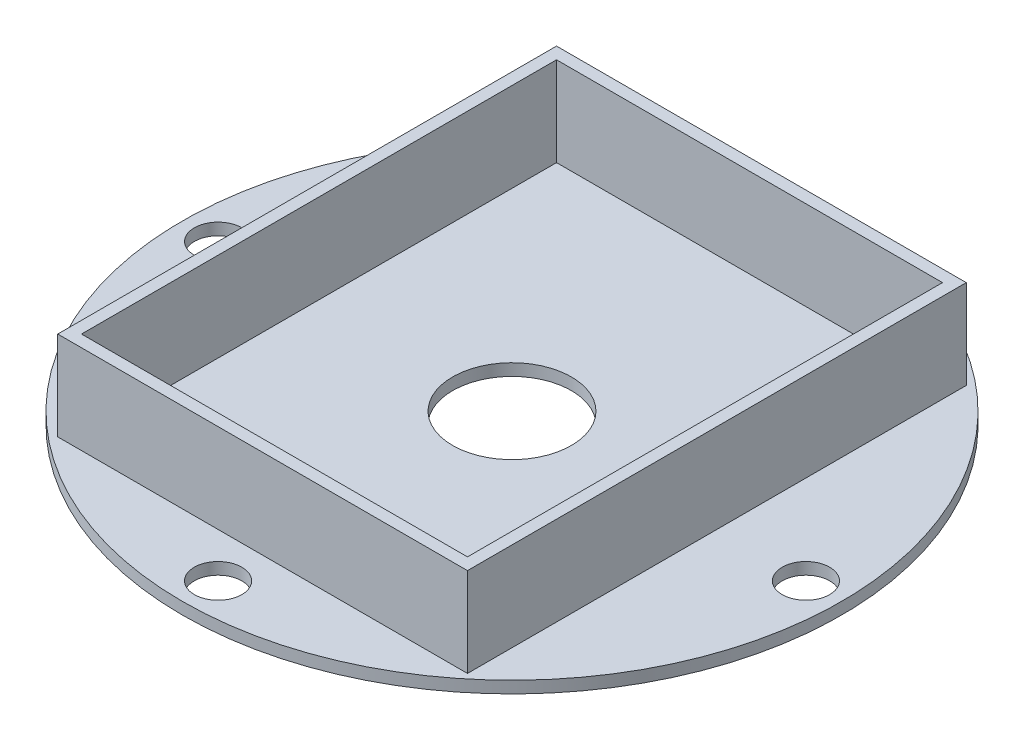
ISO-10303-21;
HEADER;
FILE_DESCRIPTION(('STEP AP214'),'2;1');
FILE_NAME('part.step','',(''),(''),'','','');
FILE_SCHEMA(('AUTOMOTIVE_DESIGN { 1 0 10303 214 1 1 1 1 }'));
ENDSEC;
DATA;
#1=APPLICATION_CONTEXT('core data for automotive mechanical design processes');
#2=APPLICATION_PROTOCOL_DEFINITION('international standard','automotive_design',2000,#1);
#3=PRODUCT_CONTEXT('',#1,'mechanical');
#4=PRODUCT('Part','Part','',(#3));
#5=PRODUCT_RELATED_PRODUCT_CATEGORY('part','',(#4));
#6=PRODUCT_DEFINITION_FORMATION('','',#4);
#7=PRODUCT_DEFINITION_CONTEXT('part definition',#1,'design');
#8=PRODUCT_DEFINITION('design','',#6,#7);
#9=PRODUCT_DEFINITION_SHAPE('','',#8);
#10=(LENGTH_UNIT() NAMED_UNIT(*) SI_UNIT(.MILLI.,.METRE.));
#11=(NAMED_UNIT(*) PLANE_ANGLE_UNIT() SI_UNIT($,.RADIAN.));
#12=(NAMED_UNIT(*) SI_UNIT($,.STERADIAN.) SOLID_ANGLE_UNIT());
#13=UNCERTAINTY_MEASURE_WITH_UNIT(LENGTH_MEASURE(1.E-05),#10,'distance_accuracy_value','');
#14=(GEOMETRIC_REPRESENTATION_CONTEXT(3) GLOBAL_UNCERTAINTY_ASSIGNED_CONTEXT((#13)) GLOBAL_UNIT_ASSIGNED_CONTEXT((#10,
#11,#12)) REPRESENTATION_CONTEXT('',''));
#15=CARTESIAN_POINT('',(0.,0.,0.));
#16=DIRECTION('',(0.,0.,1.));
#17=DIRECTION('',(1.,0.,0.));
#18=AXIS2_PLACEMENT_3D('',#15,#16,#17);
#19=CARTESIAN_POINT('',(0.,2.,0.));
#20=DIRECTION('',(0.,1.,0.));
#21=DIRECTION('',(0.,0.,1.));
#22=AXIS2_PLACEMENT_3D('',#19,#20,#21);
#23=PLANE('',#22);
#24=CARTESIAN_POINT('',(0.,2.,49.5));
#25=DIRECTION('',(0.,1.,0.));
#26=DIRECTION('',(0.,0.,1.));
#27=AXIS2_PLACEMENT_3D('',#24,#25,#26);
#28=CIRCLE('',#27,4.);
#29=CARTESIAN_POINT('',(0.,2.,53.5));
#30=VERTEX_POINT('',#29);
#31=EDGE_CURVE('E206',#30,#30,#28,.T.);
#32=ORIENTED_EDGE('',*,*,#31,.F.);
#33=EDGE_LOOP('',(#32));
#34=FACE_BOUND('',#33,.T.);
#35=CARTESIAN_POINT('',(49.5,2.,0.));
#36=DIRECTION('',(0.,1.,0.));
#37=DIRECTION('',(0.,0.,1.));
#38=AXIS2_PLACEMENT_3D('',#35,#36,#37);
#39=CIRCLE('',#38,4.);
#40=CARTESIAN_POINT('',(49.5,2.,4.));
#41=VERTEX_POINT('',#40);
#42=EDGE_CURVE('E222',#41,#41,#39,.T.);
#43=ORIENTED_EDGE('',*,*,#42,.F.);
#44=EDGE_LOOP('',(#43));
#45=FACE_BOUND('',#44,.T.);
#46=CARTESIAN_POINT('',(0.,2.,0.));
#47=DIRECTION('',(0.,1.,0.));
#48=DIRECTION('',(0.,0.,1.));
#49=AXIS2_PLACEMENT_3D('',#46,#47,#48);
#50=CIRCLE('',#49,55.5);
#51=CARTESIAN_POINT('',(0.,2.,55.5));
#52=VERTEX_POINT('',#51);
#53=EDGE_CURVE('E11',#52,#52,#50,.T.);
#54=ORIENTED_EDGE('',*,*,#53,.T.);
#55=EDGE_LOOP('',(#54));
#56=FACE_BOUND('',#55,.T.);
#57=CARTESIAN_POINT('',(0.,2.,-49.5));
#58=DIRECTION('',(0.,1.,0.));
#59=DIRECTION('',(0.,0.,1.));
#60=AXIS2_PLACEMENT_3D('',#57,#58,#59);
#61=CIRCLE('',#60,4.);
#62=CARTESIAN_POINT('',(0.,2.,-45.5));
#63=VERTEX_POINT('',#62);
#64=EDGE_CURVE('E230',#63,#63,#61,.T.);
#65=ORIENTED_EDGE('',*,*,#64,.F.);
#66=EDGE_LOOP('',(#65));
#67=FACE_BOUND('',#66,.T.);
#68=CARTESIAN_POINT('',(-49.5,2.,0.));
#69=DIRECTION('',(0.,1.,0.));
#70=DIRECTION('',(0.,0.,1.));
#71=AXIS2_PLACEMENT_3D('',#68,#69,#70);
#72=CIRCLE('',#71,4.);
#73=CARTESIAN_POINT('',(-49.5,2.,4.));
#74=VERTEX_POINT('',#73);
#75=EDGE_CURVE('E214',#74,#74,#72,.T.);
#76=ORIENTED_EDGE('',*,*,#75,.F.);
#77=EDGE_LOOP('',(#76));
#78=FACE_BOUND('',#77,.T.);
#79=DIRECTION('',(-1.,0.,0.));
#80=VECTOR('',#79,1.);
#81=CARTESIAN_POINT('',(-34.5,2.,-42.));
#82=LINE('',#81,#80);
#83=CARTESIAN_POINT('',(34.5,2.,-42.));
#84=VERTEX_POINT('',#83);
#85=CARTESIAN_POINT('',(-34.5,2.,-42.));
#86=VERTEX_POINT('',#85);
#87=EDGE_CURVE('E185',#84,#86,#82,.T.);
#88=ORIENTED_EDGE('',*,*,#87,.F.);
#89=DIRECTION('',(0.,0.,-1.));
#90=VECTOR('',#89,1.);
#91=CARTESIAN_POINT('',(34.5,2.,-42.));
#92=LINE('',#91,#90);
#93=CARTESIAN_POINT('',(34.5,2.,42.));
#94=VERTEX_POINT('',#93);
#95=EDGE_CURVE('E134',#94,#84,#92,.T.);
#96=ORIENTED_EDGE('',*,*,#95,.F.);
#97=DIRECTION('',(1.,0.,0.));
#98=VECTOR('',#97,1.);
#99=CARTESIAN_POINT('',(-34.5,2.,42.));
#100=LINE('',#99,#98);
#101=CARTESIAN_POINT('',(-34.5,2.,42.));
#102=VERTEX_POINT('',#101);
#103=EDGE_CURVE('E172',#102,#94,#100,.T.);
#104=ORIENTED_EDGE('',*,*,#103,.F.);
#105=DIRECTION('',(0.,0.,1.));
#106=VECTOR('',#105,1.);
#107=CARTESIAN_POINT('',(-34.5,2.,-42.));
#108=LINE('',#107,#106);
#109=EDGE_CURVE('E188',#86,#102,#108,.T.);
#110=ORIENTED_EDGE('',*,*,#109,.F.);
#111=EDGE_LOOP('',(#88,#96,#104,#110));
#112=FACE_BOUND('',#111,.T.);
#113=ADVANCED_FACE('F45',(#34,#45,#56,#67,#78,#112),#23,.T.);
#114=CARTESIAN_POINT('',(0.,0.,0.));
#115=DIRECTION('',(0.,1.,0.));
#116=DIRECTION('',(0.,0.,1.));
#117=AXIS2_PLACEMENT_3D('',#114,#115,#116);
#118=PLANE('',#117);
#119=CARTESIAN_POINT('',(0.,0.,0.));
#120=DIRECTION('',(0.,1.,0.));
#121=DIRECTION('',(0.,0.,1.));
#122=AXIS2_PLACEMENT_3D('',#119,#120,#121);
#123=CIRCLE('',#122,10.);
#124=CARTESIAN_POINT('',(0.,0.,10.));
#125=VERTEX_POINT('',#124);
#126=EDGE_CURVE('E49',#125,#125,#123,.T.);
#127=ORIENTED_EDGE('',*,*,#126,.T.);
#128=EDGE_LOOP('',(#127));
#129=FACE_BOUND('',#128,.T.);
#130=CARTESIAN_POINT('',(0.,0.,0.));
#131=DIRECTION('',(0.,1.,0.));
#132=DIRECTION('',(0.,0.,1.));
#133=AXIS2_PLACEMENT_3D('',#130,#131,#132);
#134=CIRCLE('',#133,55.5);
#135=CARTESIAN_POINT('',(0.,0.,55.5));
#136=VERTEX_POINT('',#135);
#137=EDGE_CURVE('E55',#136,#136,#134,.T.);
#138=ORIENTED_EDGE('',*,*,#137,.F.);
#139=EDGE_LOOP('',(#138));
#140=FACE_BOUND('',#139,.T.);
#141=CARTESIAN_POINT('',(0.,0.,-49.5));
#142=DIRECTION('',(0.,1.,0.));
#143=DIRECTION('',(0.,0.,1.));
#144=AXIS2_PLACEMENT_3D('',#141,#142,#143);
#145=CIRCLE('',#144,4.);
#146=CARTESIAN_POINT('',(0.,0.,-45.5));
#147=VERTEX_POINT('',#146);
#148=EDGE_CURVE('E226',#147,#147,#145,.T.);
#149=ORIENTED_EDGE('',*,*,#148,.T.);
#150=EDGE_LOOP('',(#149));
#151=FACE_BOUND('',#150,.T.);
#152=CARTESIAN_POINT('',(49.5,0.,0.));
#153=DIRECTION('',(0.,1.,0.));
#154=DIRECTION('',(0.,0.,1.));
#155=AXIS2_PLACEMENT_3D('',#152,#153,#154);
#156=CIRCLE('',#155,4.);
#157=CARTESIAN_POINT('',(49.5,0.,4.));
#158=VERTEX_POINT('',#157);
#159=EDGE_CURVE('E218',#158,#158,#156,.T.);
#160=ORIENTED_EDGE('',*,*,#159,.T.);
#161=EDGE_LOOP('',(#160));
#162=FACE_BOUND('',#161,.T.);
#163=CARTESIAN_POINT('',(-49.5,0.,0.));
#164=DIRECTION('',(0.,1.,0.));
#165=DIRECTION('',(0.,0.,1.));
#166=AXIS2_PLACEMENT_3D('',#163,#164,#165);
#167=CIRCLE('',#166,4.);
#168=CARTESIAN_POINT('',(-49.5,0.,4.));
#169=VERTEX_POINT('',#168);
#170=EDGE_CURVE('E210',#169,#169,#167,.T.);
#171=ORIENTED_EDGE('',*,*,#170,.T.);
#172=EDGE_LOOP('',(#171));
#173=FACE_BOUND('',#172,.T.);
#174=CARTESIAN_POINT('',(0.,0.,49.5));
#175=DIRECTION('',(0.,1.,0.));
#176=DIRECTION('',(0.,0.,1.));
#177=AXIS2_PLACEMENT_3D('',#174,#175,#176);
#178=CIRCLE('',#177,4.);
#179=CARTESIAN_POINT('',(0.,0.,53.5));
#180=VERTEX_POINT('',#179);
#181=EDGE_CURVE('E205',#180,#180,#178,.T.);
#182=ORIENTED_EDGE('',*,*,#181,.T.);
#183=EDGE_LOOP('',(#182));
#184=FACE_BOUND('',#183,.T.);
#185=ADVANCED_FACE('F241',(#129,#140,#151,#162,#173,#184),#118,.F.);
#186=CARTESIAN_POINT('',(0.,2.,0.));
#187=DIRECTION('',(0.,-1.,0.));
#188=DIRECTION('',(0.,0.,-1.));
#189=AXIS2_PLACEMENT_3D('',#186,#187,#188);
#190=CYLINDRICAL_SURFACE('',#189,55.5);
#191=ORIENTED_EDGE('',*,*,#53,.F.);
#192=EDGE_LOOP('',(#191));
#193=FACE_BOUND('',#192,.T.);
#194=ORIENTED_EDGE('',*,*,#137,.T.);
#195=EDGE_LOOP('',(#194));
#196=FACE_BOUND('',#195,.T.);
#197=ADVANCED_FACE('F47',(#193,#196),#190,.T.);
#198=CARTESIAN_POINT('',(0.,2.,-49.5));
#199=DIRECTION('',(0.,-1.,0.));
#200=DIRECTION('',(0.,0.,-1.));
#201=AXIS2_PLACEMENT_3D('',#198,#199,#200);
#202=CYLINDRICAL_SURFACE('',#201,4.);
#203=ORIENTED_EDGE('',*,*,#64,.T.);
#204=EDGE_LOOP('',(#203));
#205=FACE_BOUND('',#204,.T.);
#206=ORIENTED_EDGE('',*,*,#148,.F.);
#207=EDGE_LOOP('',(#206));
#208=FACE_BOUND('',#207,.T.);
#209=ADVANCED_FACE('F408',(#205,#208),#202,.F.);
#210=CARTESIAN_POINT('',(49.5,2.,0.));
#211=DIRECTION('',(0.,-1.,0.));
#212=DIRECTION('',(0.,0.,-1.));
#213=AXIS2_PLACEMENT_3D('',#210,#211,#212);
#214=CYLINDRICAL_SURFACE('',#213,4.);
#215=ORIENTED_EDGE('',*,*,#42,.T.);
#216=EDGE_LOOP('',(#215));
#217=FACE_BOUND('',#216,.T.);
#218=ORIENTED_EDGE('',*,*,#159,.F.);
#219=EDGE_LOOP('',(#218));
#220=FACE_BOUND('',#219,.T.);
#221=ADVANCED_FACE('F266',(#217,#220),#214,.F.);
#222=CARTESIAN_POINT('',(-49.5,2.,0.));
#223=DIRECTION('',(0.,-1.,0.));
#224=DIRECTION('',(0.,0.,-1.));
#225=AXIS2_PLACEMENT_3D('',#222,#223,#224);
#226=CYLINDRICAL_SURFACE('',#225,4.);
#227=ORIENTED_EDGE('',*,*,#75,.T.);
#228=EDGE_LOOP('',(#227));
#229=FACE_BOUND('',#228,.T.);
#230=ORIENTED_EDGE('',*,*,#170,.F.);
#231=EDGE_LOOP('',(#230));
#232=FACE_BOUND('',#231,.T.);
#233=ADVANCED_FACE('F255',(#229,#232),#226,.F.);
#234=CARTESIAN_POINT('',(0.,2.,49.5));
#235=DIRECTION('',(0.,-1.,0.));
#236=DIRECTION('',(0.,0.,-1.));
#237=AXIS2_PLACEMENT_3D('',#234,#235,#236);
#238=CYLINDRICAL_SURFACE('',#237,4.);
#239=ORIENTED_EDGE('',*,*,#31,.T.);
#240=EDGE_LOOP('',(#239));
#241=FACE_BOUND('',#240,.T.);
#242=ORIENTED_EDGE('',*,*,#181,.F.);
#243=EDGE_LOOP('',(#242));
#244=FACE_BOUND('',#243,.T.);
#245=ADVANCED_FACE('F253',(#241,#244),#238,.F.);
#246=CARTESIAN_POINT('',(0.,17.,0.));
#247=DIRECTION('',(0.,1.,0.));
#248=DIRECTION('',(0.,0.,1.));
#249=AXIS2_PLACEMENT_3D('',#246,#247,#248);
#250=PLANE('',#249);
#251=DIRECTION('',(0.,0.,-1.));
#252=VECTOR('',#251,1.);
#253=CARTESIAN_POINT('',(34.5,17.,-42.));
#254=LINE('',#253,#252);
#255=CARTESIAN_POINT('',(34.5,17.,42.));
#256=VERTEX_POINT('',#255);
#257=CARTESIAN_POINT('',(34.5,17.,-42.));
#258=VERTEX_POINT('',#257);
#259=EDGE_CURVE('E167',#256,#258,#254,.T.);
#260=ORIENTED_EDGE('',*,*,#259,.T.);
#261=DIRECTION('',(-1.,0.,0.));
#262=VECTOR('',#261,1.);
#263=CARTESIAN_POINT('',(-34.5,17.,-42.));
#264=LINE('',#263,#262);
#265=CARTESIAN_POINT('',(-34.5,17.,-42.));
#266=VERTEX_POINT('',#265);
#267=EDGE_CURVE('E171',#258,#266,#264,.T.);
#268=ORIENTED_EDGE('',*,*,#267,.T.);
#269=DIRECTION('',(0.,0.,1.));
#270=VECTOR('',#269,1.);
#271=CARTESIAN_POINT('',(-34.5,17.,-42.));
#272=LINE('',#271,#270);
#273=CARTESIAN_POINT('',(-34.5,17.,42.));
#274=VERTEX_POINT('',#273);
#275=EDGE_CURVE('E175',#266,#274,#272,.T.);
#276=ORIENTED_EDGE('',*,*,#275,.T.);
#277=DIRECTION('',(1.,0.,0.));
#278=VECTOR('',#277,1.);
#279=CARTESIAN_POINT('',(-34.5,17.,42.));
#280=LINE('',#279,#278);
#281=EDGE_CURVE('E178',#274,#256,#280,.T.);
#282=ORIENTED_EDGE('',*,*,#281,.T.);
#283=EDGE_LOOP('',(#260,#268,#276,#282));
#284=FACE_BOUND('',#283,.T.);
#285=DIRECTION('',(-1.,0.,0.));
#286=VECTOR('',#285,1.);
#287=CARTESIAN_POINT('',(-32.5,17.,-40.));
#288=LINE('',#287,#286);
#289=CARTESIAN_POINT('',(32.5,17.,-40.));
#290=VERTEX_POINT('',#289);
#291=CARTESIAN_POINT('',(-32.5,17.,-40.));
#292=VERTEX_POINT('',#291);
#293=EDGE_CURVE('E125',#290,#292,#288,.T.);
#294=ORIENTED_EDGE('',*,*,#293,.F.);
#295=DIRECTION('',(0.,0.,-1.));
#296=VECTOR('',#295,1.);
#297=CARTESIAN_POINT('',(32.5,17.,-40.));
#298=LINE('',#297,#296);
#299=CARTESIAN_POINT('',(32.5,17.,40.));
#300=VERTEX_POINT('',#299);
#301=EDGE_CURVE('E115',#300,#290,#298,.T.);
#302=ORIENTED_EDGE('',*,*,#301,.F.);
#303=DIRECTION('',(1.,0.,0.));
#304=VECTOR('',#303,1.);
#305=CARTESIAN_POINT('',(-32.5,17.,40.));
#306=LINE('',#305,#304);
#307=CARTESIAN_POINT('',(-32.5,17.,40.));
#308=VERTEX_POINT('',#307);
#309=EDGE_CURVE('E144',#308,#300,#306,.T.);
#310=ORIENTED_EDGE('',*,*,#309,.F.);
#311=DIRECTION('',(0.,0.,1.));
#312=VECTOR('',#311,1.);
#313=CARTESIAN_POINT('',(-32.5,17.,-40.));
#314=LINE('',#313,#312);
#315=EDGE_CURVE('E140',#292,#308,#314,.T.);
#316=ORIENTED_EDGE('',*,*,#315,.F.);
#317=EDGE_LOOP('',(#294,#302,#310,#316));
#318=FACE_BOUND('',#317,.T.);
#319=ADVANCED_FACE('F138',(#284,#318),#250,.T.);
#320=CARTESIAN_POINT('',(34.5,17.,-42.));
#321=DIRECTION('',(-1.,0.,0.));
#322=DIRECTION('',(0.,0.,1.));
#323=AXIS2_PLACEMENT_3D('',#320,#321,#322);
#324=PLANE('',#323);
#325=ORIENTED_EDGE('',*,*,#95,.T.);
#326=DIRECTION('',(0.,-1.,0.));
#327=VECTOR('',#326,1.);
#328=CARTESIAN_POINT('',(34.5,17.,-42.));
#329=LINE('',#328,#327);
#330=EDGE_CURVE('E202',#258,#84,#329,.T.);
#331=ORIENTED_EDGE('',*,*,#330,.F.);
#332=ORIENTED_EDGE('',*,*,#259,.F.);
#333=DIRECTION('',(0.,-1.,0.));
#334=VECTOR('',#333,1.);
#335=CARTESIAN_POINT('',(34.5,17.,42.));
#336=LINE('',#335,#334);
#337=EDGE_CURVE('E181',#256,#94,#336,.T.);
#338=ORIENTED_EDGE('',*,*,#337,.T.);
#339=EDGE_LOOP('',(#325,#331,#332,#338));
#340=FACE_BOUND('',#339,.T.);
#341=ADVANCED_FACE('F263',(#340),#324,.F.);
#342=CARTESIAN_POINT('',(-34.5,17.,-42.));
#343=DIRECTION('',(0.,0.,1.));
#344=DIRECTION('',(1.,0.,0.));
#345=AXIS2_PLACEMENT_3D('',#342,#343,#344);
#346=PLANE('',#345);
#347=ORIENTED_EDGE('',*,*,#87,.T.);
#348=DIRECTION('',(0.,-1.,0.));
#349=VECTOR('',#348,1.);
#350=CARTESIAN_POINT('',(-34.5,17.,-42.));
#351=LINE('',#350,#349);
#352=EDGE_CURVE('E198',#266,#86,#351,.T.);
#353=ORIENTED_EDGE('',*,*,#352,.F.);
#354=ORIENTED_EDGE('',*,*,#267,.F.);
#355=ORIENTED_EDGE('',*,*,#330,.T.);
#356=EDGE_LOOP('',(#347,#353,#354,#355));
#357=FACE_BOUND('',#356,.T.);
#358=ADVANCED_FACE('F316',(#357),#346,.F.);
#359=CARTESIAN_POINT('',(-34.5,17.,-42.));
#360=DIRECTION('',(1.,0.,0.));
#361=DIRECTION('',(0.,0.,-1.));
#362=AXIS2_PLACEMENT_3D('',#359,#360,#361);
#363=PLANE('',#362);
#364=ORIENTED_EDGE('',*,*,#109,.T.);
#365=DIRECTION('',(0.,-1.,0.));
#366=VECTOR('',#365,1.);
#367=CARTESIAN_POINT('',(-34.5,17.,42.));
#368=LINE('',#367,#366);
#369=EDGE_CURVE('E63',#274,#102,#368,.T.);
#370=ORIENTED_EDGE('',*,*,#369,.F.);
#371=ORIENTED_EDGE('',*,*,#275,.F.);
#372=ORIENTED_EDGE('',*,*,#352,.T.);
#373=EDGE_LOOP('',(#364,#370,#371,#372));
#374=FACE_BOUND('',#373,.T.);
#375=ADVANCED_FACE('F313',(#374),#363,.F.);
#376=CARTESIAN_POINT('',(-34.5,17.,42.));
#377=DIRECTION('',(0.,0.,-1.));
#378=DIRECTION('',(-1.,0.,0.));
#379=AXIS2_PLACEMENT_3D('',#376,#377,#378);
#380=PLANE('',#379);
#381=ORIENTED_EDGE('',*,*,#103,.T.);
#382=ORIENTED_EDGE('',*,*,#337,.F.);
#383=ORIENTED_EDGE('',*,*,#281,.F.);
#384=ORIENTED_EDGE('',*,*,#369,.T.);
#385=EDGE_LOOP('',(#381,#382,#383,#384));
#386=FACE_BOUND('',#385,.T.);
#387=ADVANCED_FACE('F309',(#386),#380,.F.);
#388=CARTESIAN_POINT('',(32.5,17.,-40.));
#389=DIRECTION('',(-1.,0.,0.));
#390=DIRECTION('',(0.,0.,1.));
#391=AXIS2_PLACEMENT_3D('',#388,#389,#390);
#392=PLANE('',#391);
#393=DIRECTION('',(0.,0.,-1.));
#394=VECTOR('',#393,1.);
#395=CARTESIAN_POINT('',(32.5,2.,-40.));
#396=LINE('',#395,#394);
#397=CARTESIAN_POINT('',(32.5,2.,40.));
#398=VERTEX_POINT('',#397);
#399=CARTESIAN_POINT('',(32.5,2.,-40.));
#400=VERTEX_POINT('',#399);
#401=EDGE_CURVE('E71',#398,#400,#396,.T.);
#402=ORIENTED_EDGE('',*,*,#401,.F.);
#403=DIRECTION('',(0.,-1.,0.));
#404=VECTOR('',#403,1.);
#405=CARTESIAN_POINT('',(32.5,17.,40.));
#406=LINE('',#405,#404);
#407=EDGE_CURVE('E120',#300,#398,#406,.T.);
#408=ORIENTED_EDGE('',*,*,#407,.F.);
#409=ORIENTED_EDGE('',*,*,#301,.T.);
#410=DIRECTION('',(0.,-1.,0.));
#411=VECTOR('',#410,1.);
#412=CARTESIAN_POINT('',(32.5,17.,-40.));
#413=LINE('',#412,#411);
#414=EDGE_CURVE('E118',#290,#400,#413,.T.);
#415=ORIENTED_EDGE('',*,*,#414,.T.);
#416=EDGE_LOOP('',(#402,#408,#409,#415));
#417=FACE_BOUND('',#416,.T.);
#418=ADVANCED_FACE('F117',(#417),#392,.T.);
#419=CARTESIAN_POINT('',(-32.5,17.,-40.));
#420=DIRECTION('',(0.,0.,1.));
#421=DIRECTION('',(1.,0.,0.));
#422=AXIS2_PLACEMENT_3D('',#419,#420,#421);
#423=PLANE('',#422);
#424=DIRECTION('',(-1.,0.,0.));
#425=VECTOR('',#424,1.);
#426=CARTESIAN_POINT('',(-32.5,2.,-40.));
#427=LINE('',#426,#425);
#428=CARTESIAN_POINT('',(-32.5,2.,-40.));
#429=VERTEX_POINT('',#428);
#430=EDGE_CURVE('E132',#400,#429,#427,.T.);
#431=ORIENTED_EDGE('',*,*,#430,.F.);
#432=ORIENTED_EDGE('',*,*,#414,.F.);
#433=ORIENTED_EDGE('',*,*,#293,.T.);
#434=DIRECTION('',(0.,-1.,0.));
#435=VECTOR('',#434,1.);
#436=CARTESIAN_POINT('',(-32.5,17.,-40.));
#437=LINE('',#436,#435);
#438=EDGE_CURVE('E135',#292,#429,#437,.T.);
#439=ORIENTED_EDGE('',*,*,#438,.T.);
#440=EDGE_LOOP('',(#431,#432,#433,#439));
#441=FACE_BOUND('',#440,.T.);
#442=ADVANCED_FACE('F129',(#441),#423,.T.);
#443=CARTESIAN_POINT('',(-32.5,17.,-40.));
#444=DIRECTION('',(1.,0.,0.));
#445=DIRECTION('',(0.,0.,-1.));
#446=AXIS2_PLACEMENT_3D('',#443,#444,#445);
#447=PLANE('',#446);
#448=DIRECTION('',(0.,0.,1.));
#449=VECTOR('',#448,1.);
#450=CARTESIAN_POINT('',(-32.5,2.,-40.));
#451=LINE('',#450,#449);
#452=CARTESIAN_POINT('',(-32.5,2.,40.));
#453=VERTEX_POINT('',#452);
#454=EDGE_CURVE('E154',#429,#453,#451,.T.);
#455=ORIENTED_EDGE('',*,*,#454,.F.);
#456=ORIENTED_EDGE('',*,*,#438,.F.);
#457=ORIENTED_EDGE('',*,*,#315,.T.);
#458=DIRECTION('',(0.,-1.,0.));
#459=VECTOR('',#458,1.);
#460=CARTESIAN_POINT('',(-32.5,17.,40.));
#461=LINE('',#460,#459);
#462=EDGE_CURVE('E161',#308,#453,#461,.T.);
#463=ORIENTED_EDGE('',*,*,#462,.T.);
#464=EDGE_LOOP('',(#455,#456,#457,#463));
#465=FACE_BOUND('',#464,.T.);
#466=ADVANCED_FACE('F288',(#465),#447,.T.);
#467=CARTESIAN_POINT('',(-32.5,17.,40.));
#468=DIRECTION('',(0.,0.,-1.));
#469=DIRECTION('',(-1.,0.,0.));
#470=AXIS2_PLACEMENT_3D('',#467,#468,#469);
#471=PLANE('',#470);
#472=DIRECTION('',(1.,0.,0.));
#473=VECTOR('',#472,1.);
#474=CARTESIAN_POINT('',(-32.5,2.,40.));
#475=LINE('',#474,#473);
#476=EDGE_CURVE('E126',#453,#398,#475,.T.);
#477=ORIENTED_EDGE('',*,*,#476,.F.);
#478=ORIENTED_EDGE('',*,*,#462,.F.);
#479=ORIENTED_EDGE('',*,*,#309,.T.);
#480=ORIENTED_EDGE('',*,*,#407,.T.);
#481=EDGE_LOOP('',(#477,#478,#479,#480));
#482=FACE_BOUND('',#481,.T.);
#483=ADVANCED_FACE('F280',(#482),#471,.T.);
#484=CARTESIAN_POINT('',(0.,2.,0.));
#485=DIRECTION('',(0.,1.,0.));
#486=DIRECTION('',(0.,0.,1.));
#487=AXIS2_PLACEMENT_3D('',#484,#485,#486);
#488=CIRCLE('',#487,10.);
#489=CARTESIAN_POINT('',(0.,2.,10.));
#490=VERTEX_POINT('',#489);
#491=EDGE_CURVE('E293',#490,#490,#488,.T.);
#492=ORIENTED_EDGE('',*,*,#491,.F.);
#493=EDGE_LOOP('',(#492));
#494=FACE_BOUND('',#493,.T.);
#495=ORIENTED_EDGE('',*,*,#401,.T.);
#496=ORIENTED_EDGE('',*,*,#430,.T.);
#497=ORIENTED_EDGE('',*,*,#454,.T.);
#498=ORIENTED_EDGE('',*,*,#476,.T.);
#499=EDGE_LOOP('',(#495,#496,#497,#498));
#500=FACE_BOUND('',#499,.T.);
#501=ADVANCED_FACE('F272',(#494,#500),#23,.T.);
#502=CARTESIAN_POINT('',(0.,-28.,0.));
#503=DIRECTION('',(0.,1.,0.));
#504=DIRECTION('',(0.,0.,1.));
#505=AXIS2_PLACEMENT_3D('',#502,#503,#504);
#506=CYLINDRICAL_SURFACE('',#505,10.);
#507=ORIENTED_EDGE('',*,*,#491,.T.);
#508=EDGE_LOOP('',(#507));
#509=FACE_BOUND('',#508,.T.);
#510=ORIENTED_EDGE('',*,*,#126,.F.);
#511=EDGE_LOOP('',(#510));
#512=FACE_BOUND('',#511,.T.);
#513=ADVANCED_FACE('F279',(#509,#512),#506,.F.);
#514=CLOSED_SHELL('',(#113,#185,#197,#209,#221,#233,#245,#319,#341,#358,#375,#387,#418,#442,
#466,#483,#501,#513));
#515=MANIFOLD_SOLID_BREP('B2',#514);
#516=ADVANCED_BREP_SHAPE_REPRESENTATION('',(#18,#515),#14);
#517=SHAPE_DEFINITION_REPRESENTATION(#9,#516);
ENDSEC;
END-ISO-10303-21;
